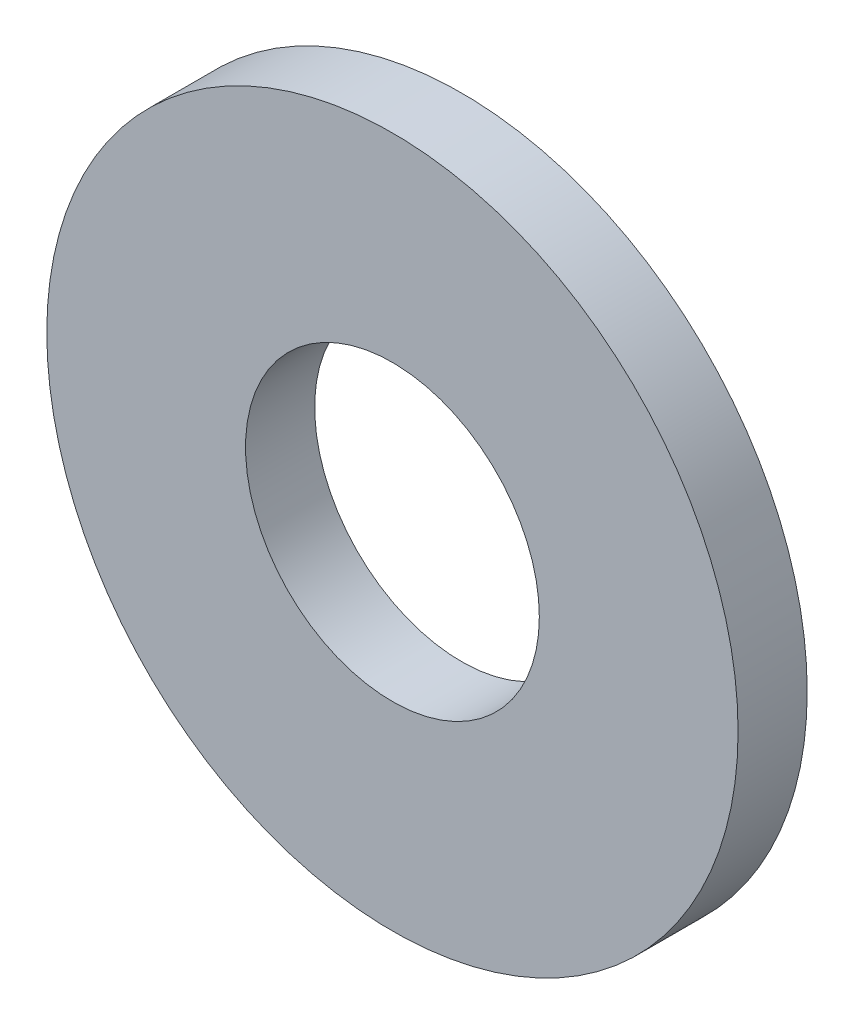
ISO-10303-21;
HEADER;
FILE_DESCRIPTION(('STEP AP214'),'2;1');
FILE_NAME('part.step','',(''),(''),'','','');
FILE_SCHEMA(('AUTOMOTIVE_DESIGN { 1 0 10303 214 1 1 1 1 }'));
ENDSEC;
DATA;
#1=APPLICATION_CONTEXT('core data for automotive mechanical design processes');
#2=APPLICATION_PROTOCOL_DEFINITION('international standard','automotive_design',2000,#1);
#3=PRODUCT_CONTEXT('',#1,'mechanical');
#4=PRODUCT('Part','Part','',(#3));
#5=PRODUCT_RELATED_PRODUCT_CATEGORY('part','',(#4));
#6=PRODUCT_DEFINITION_FORMATION('','',#4);
#7=PRODUCT_DEFINITION_CONTEXT('part definition',#1,'design');
#8=PRODUCT_DEFINITION('design','',#6,#7);
#9=PRODUCT_DEFINITION_SHAPE('','',#8);
#10=(LENGTH_UNIT() NAMED_UNIT(*) SI_UNIT(.MILLI.,.METRE.));
#11=(NAMED_UNIT(*) PLANE_ANGLE_UNIT() SI_UNIT($,.RADIAN.));
#12=(NAMED_UNIT(*) SI_UNIT($,.STERADIAN.) SOLID_ANGLE_UNIT());
#13=UNCERTAINTY_MEASURE_WITH_UNIT(LENGTH_MEASURE(1.E-05),#10,'distance_accuracy_value','');
#14=(GEOMETRIC_REPRESENTATION_CONTEXT(3) GLOBAL_UNCERTAINTY_ASSIGNED_CONTEXT((#13)) GLOBAL_UNIT_ASSIGNED_CONTEXT((#10,
#11,#12)) REPRESENTATION_CONTEXT('',''));
#15=CARTESIAN_POINT('',(0.,0.,0.));
#16=DIRECTION('',(0.,0.,1.));
#17=DIRECTION('',(1.,0.,0.));
#18=AXIS2_PLACEMENT_3D('',#15,#16,#17);
#19=CARTESIAN_POINT('',(0.,0.,0.4));
#20=DIRECTION('',(0.,0.,1.));
#21=DIRECTION('',(1.,0.,0.));
#22=AXIS2_PLACEMENT_3D('',#19,#20,#21);
#23=PLANE('',#22);
#24=CARTESIAN_POINT('',(0.,0.,0.4));
#25=DIRECTION('',(0.,0.,1.));
#26=DIRECTION('',(1.,0.,0.));
#27=AXIS2_PLACEMENT_3D('',#24,#25,#26);
#28=CIRCLE('',#27,2.);
#29=CARTESIAN_POINT('',(2.,0.,0.4));
#30=VERTEX_POINT('',#29);
#31=EDGE_CURVE('E10',#30,#30,#28,.T.);
#32=ORIENTED_EDGE('',*,*,#31,.T.);
#33=EDGE_LOOP('',(#32));
#34=FACE_BOUND('',#33,.T.);
#35=CARTESIAN_POINT('',(0.,0.,0.4));
#36=DIRECTION('',(0.,0.,1.));
#37=DIRECTION('',(1.,0.,0.));
#38=AXIS2_PLACEMENT_3D('',#35,#36,#37);
#39=CIRCLE('',#38,0.85);
#40=CARTESIAN_POINT('',(0.85,0.,0.4));
#41=VERTEX_POINT('',#40);
#42=EDGE_CURVE('E46',#41,#41,#39,.T.);
#43=ORIENTED_EDGE('',*,*,#42,.F.);
#44=EDGE_LOOP('',(#43));
#45=FACE_BOUND('',#44,.T.);
#46=ADVANCED_FACE('F35',(#34,#45),#23,.T.);
#47=CARTESIAN_POINT('',(0.,0.,0.));
#48=DIRECTION('',(0.,0.,1.));
#49=DIRECTION('',(1.,0.,0.));
#50=AXIS2_PLACEMENT_3D('',#47,#48,#49);
#51=PLANE('',#50);
#52=CARTESIAN_POINT('',(0.,0.,0.));
#53=DIRECTION('',(0.,0.,1.));
#54=DIRECTION('',(1.,0.,0.));
#55=AXIS2_PLACEMENT_3D('',#52,#53,#54);
#56=CIRCLE('',#55,2.);
#57=CARTESIAN_POINT('',(2.,0.,0.));
#58=VERTEX_POINT('',#57);
#59=EDGE_CURVE('E39',#58,#58,#56,.T.);
#60=ORIENTED_EDGE('',*,*,#59,.F.);
#61=EDGE_LOOP('',(#60));
#62=FACE_BOUND('',#61,.T.);
#63=CARTESIAN_POINT('',(0.,0.,0.));
#64=DIRECTION('',(0.,0.,1.));
#65=DIRECTION('',(1.,0.,0.));
#66=AXIS2_PLACEMENT_3D('',#63,#64,#65);
#67=CIRCLE('',#66,0.85);
#68=CARTESIAN_POINT('',(0.85,0.,0.));
#69=VERTEX_POINT('',#68);
#70=EDGE_CURVE('E48',#69,#69,#67,.T.);
#71=ORIENTED_EDGE('',*,*,#70,.T.);
#72=EDGE_LOOP('',(#71));
#73=FACE_BOUND('',#72,.T.);
#74=ADVANCED_FACE('F58',(#62,#73),#51,.F.);
#75=CARTESIAN_POINT('',(0.,0.,0.4));
#76=DIRECTION('',(0.,0.,-1.));
#77=DIRECTION('',(-1.,0.,0.));
#78=AXIS2_PLACEMENT_3D('',#75,#76,#77);
#79=CYLINDRICAL_SURFACE('',#78,2.);
#80=ORIENTED_EDGE('',*,*,#31,.F.);
#81=EDGE_LOOP('',(#80));
#82=FACE_BOUND('',#81,.T.);
#83=ORIENTED_EDGE('',*,*,#59,.T.);
#84=EDGE_LOOP('',(#83));
#85=FACE_BOUND('',#84,.T.);
#86=ADVANCED_FACE('F37',(#82,#85),#79,.T.);
#87=CARTESIAN_POINT('',(0.,0.,0.4));
#88=DIRECTION('',(0.,0.,-1.));
#89=DIRECTION('',(-1.,0.,0.));
#90=AXIS2_PLACEMENT_3D('',#87,#88,#89);
#91=CYLINDRICAL_SURFACE('',#90,0.85);
#92=ORIENTED_EDGE('',*,*,#42,.T.);
#93=EDGE_LOOP('',(#92));
#94=FACE_BOUND('',#93,.T.);
#95=ORIENTED_EDGE('',*,*,#70,.F.);
#96=EDGE_LOOP('',(#95));
#97=FACE_BOUND('',#96,.T.);
#98=ADVANCED_FACE('F54',(#94,#97),#91,.F.);
#99=CLOSED_SHELL('',(#46,#74,#86,#98));
#100=MANIFOLD_SOLID_BREP('B2',#99);
#101=ADVANCED_BREP_SHAPE_REPRESENTATION('',(#18,#100),#14);
#102=SHAPE_DEFINITION_REPRESENTATION(#9,#101);
ENDSEC;
END-ISO-10303-21;
